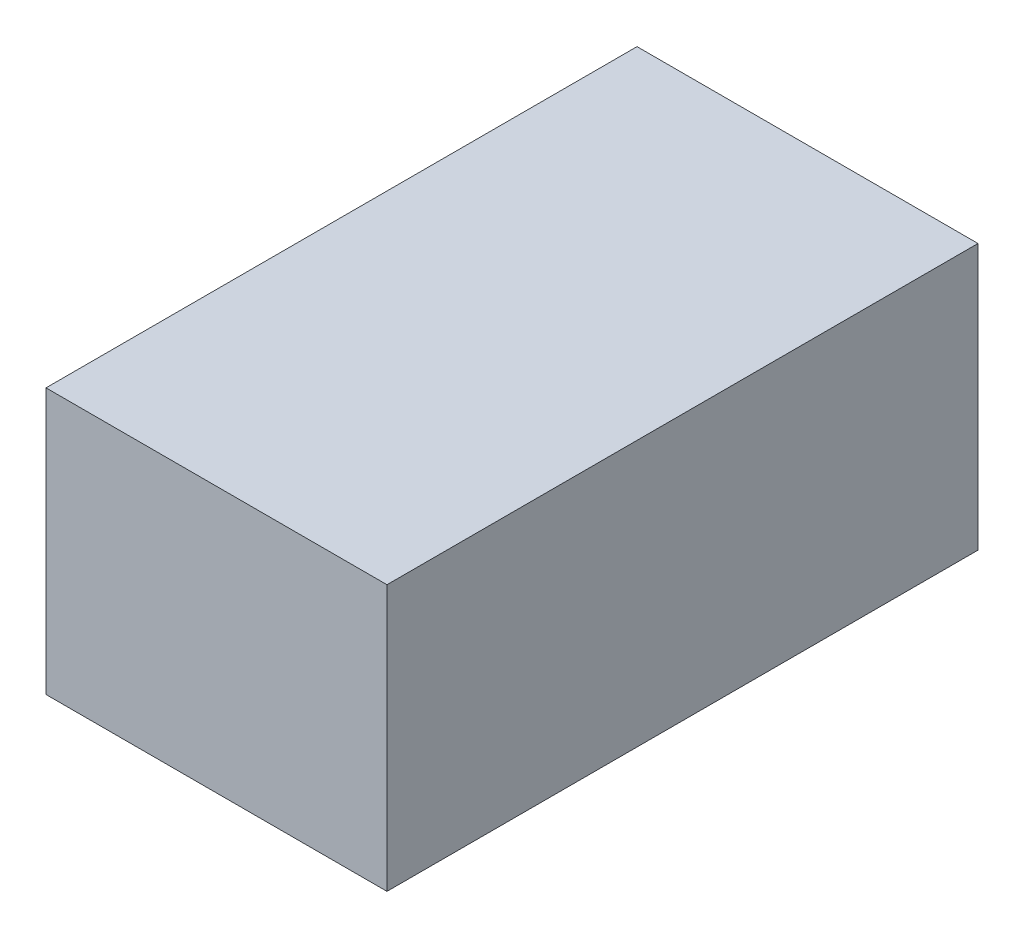
ISO-10303-21;
HEADER;
FILE_DESCRIPTION(('STEP AP214'),'2;1');
FILE_NAME('part.step','',(''),(''),'','','');
FILE_SCHEMA(('AUTOMOTIVE_DESIGN { 1 0 10303 214 1 1 1 1 }'));
ENDSEC;
DATA;
#1=APPLICATION_CONTEXT('core data for automotive mechanical design processes');
#2=APPLICATION_PROTOCOL_DEFINITION('international standard','automotive_design',2000,#1);
#3=PRODUCT_CONTEXT('',#1,'mechanical');
#4=PRODUCT('Part','Part','',(#3));
#5=PRODUCT_RELATED_PRODUCT_CATEGORY('part','',(#4));
#6=PRODUCT_DEFINITION_FORMATION('','',#4);
#7=PRODUCT_DEFINITION_CONTEXT('part definition',#1,'design');
#8=PRODUCT_DEFINITION('design','',#6,#7);
#9=PRODUCT_DEFINITION_SHAPE('','',#8);
#10=(LENGTH_UNIT() NAMED_UNIT(*) SI_UNIT(.MILLI.,.METRE.));
#11=(NAMED_UNIT(*) PLANE_ANGLE_UNIT() SI_UNIT($,.RADIAN.));
#12=(NAMED_UNIT(*) SI_UNIT($,.STERADIAN.) SOLID_ANGLE_UNIT());
#13=UNCERTAINTY_MEASURE_WITH_UNIT(LENGTH_MEASURE(1.E-05),#10,'distance_accuracy_value','');
#14=(GEOMETRIC_REPRESENTATION_CONTEXT(3) GLOBAL_UNCERTAINTY_ASSIGNED_CONTEXT((#13)) GLOBAL_UNIT_ASSIGNED_CONTEXT((#10,
#11,#12)) REPRESENTATION_CONTEXT('',''));
#15=CARTESIAN_POINT('',(0.,0.,0.));
#16=DIRECTION('',(0.,0.,1.));
#17=DIRECTION('',(1.,0.,0.));
#18=AXIS2_PLACEMENT_3D('',#15,#16,#17);
#19=CARTESIAN_POINT('',(-4.15076435804921,1.735,3.45567102980451));
#20=DIRECTION('',(0.,1.,0.));
#21=DIRECTION('',(0.,0.,1.));
#22=AXIS2_PLACEMENT_3D('',#19,#20,#21);
#23=PLANE('',#22);
#24=DIRECTION('',(0.,0.,1.));
#25=VECTOR('',#24,1.);
#26=CARTESIAN_POINT('',(-4.66430862572949,1.735,2.56552763249203));
#27=LINE('',#26,#25);
#28=CARTESIAN_POINT('',(-4.66430862572949,1.735,2.56552763249203));
#29=VERTEX_POINT('',#28);
#30=CARTESIAN_POINT('',(-4.66430862572949,1.735,4.34581442711699));
#31=VERTEX_POINT('',#30);
#32=EDGE_CURVE('E61',#29,#31,#27,.T.);
#33=ORIENTED_EDGE('',*,*,#32,.F.);
#34=DIRECTION('',(1.,0.,0.));
#35=VECTOR('',#34,1.);
#36=CARTESIAN_POINT('',(-4.15076435804921,1.735,2.56552763249203));
#37=LINE('',#36,#35);
#38=CARTESIAN_POINT('',(-3.63722009036893,1.735,2.56552763249203));
#39=VERTEX_POINT('',#38);
#40=EDGE_CURVE('E19',#39,#29,#37,.F.);
#41=ORIENTED_EDGE('',*,*,#40,.F.);
#42=DIRECTION('',(0.,0.,-1.));
#43=VECTOR('',#42,1.);
#44=CARTESIAN_POINT('',(-3.63722009036893,1.735,4.34581442711699));
#45=LINE('',#44,#43);
#46=CARTESIAN_POINT('',(-3.63722009036893,1.735,4.34581442711699));
#47=VERTEX_POINT('',#46);
#48=EDGE_CURVE('E68',#47,#39,#45,.T.);
#49=ORIENTED_EDGE('',*,*,#48,.F.);
#50=DIRECTION('',(1.,0.,0.));
#51=VECTOR('',#50,1.);
#52=CARTESIAN_POINT('',(-4.66430862572949,1.735,4.34581442711699));
#53=LINE('',#52,#51);
#54=EDGE_CURVE('E55',#31,#47,#53,.T.);
#55=ORIENTED_EDGE('',*,*,#54,.F.);
#56=EDGE_LOOP('',(#33,#41,#49,#55));
#57=FACE_BOUND('',#56,.T.);
#58=ADVANCED_FACE('F16',(#57),#23,.F.);
#59=CARTESIAN_POINT('',(-4.66430862572949,1.735,2.56552763249203));
#60=DIRECTION('',(-1.,0.,0.));
#61=DIRECTION('',(0.,0.,1.));
#62=AXIS2_PLACEMENT_3D('',#59,#60,#61);
#63=PLANE('',#62);
#64=ORIENTED_EDGE('',*,*,#32,.T.);
#65=DIRECTION('',(0.,1.,0.));
#66=VECTOR('',#65,1.);
#67=CARTESIAN_POINT('',(-4.66430862572949,1.735,4.34581442711699));
#68=LINE('',#67,#66);
#69=CARTESIAN_POINT('',(-4.66430862572949,2.535,4.34581442711699));
#70=VERTEX_POINT('',#69);
#71=EDGE_CURVE('E63',#70,#31,#68,.F.);
#72=ORIENTED_EDGE('',*,*,#71,.F.);
#73=DIRECTION('',(0.,0.,1.));
#74=VECTOR('',#73,1.);
#75=CARTESIAN_POINT('',(-4.66430862572949,2.535,3.45567102980451));
#76=LINE('',#75,#74);
#77=CARTESIAN_POINT('',(-4.66430862572949,2.535,2.56552763249203));
#78=VERTEX_POINT('',#77);
#79=EDGE_CURVE('E82',#78,#70,#76,.T.);
#80=ORIENTED_EDGE('',*,*,#79,.F.);
#81=DIRECTION('',(0.,1.,0.));
#82=VECTOR('',#81,1.);
#83=CARTESIAN_POINT('',(-4.66430862572949,1.735,2.56552763249203));
#84=LINE('',#83,#82);
#85=EDGE_CURVE('E66',#29,#78,#84,.T.);
#86=ORIENTED_EDGE('',*,*,#85,.F.);
#87=EDGE_LOOP('',(#64,#72,#80,#86));
#88=FACE_BOUND('',#87,.T.);
#89=ADVANCED_FACE('F62',(#88),#63,.T.);
#90=CARTESIAN_POINT('',(-4.66430862572949,1.735,4.34581442711699));
#91=DIRECTION('',(0.,0.,1.));
#92=DIRECTION('',(1.,0.,0.));
#93=AXIS2_PLACEMENT_3D('',#90,#91,#92);
#94=PLANE('',#93);
#95=ORIENTED_EDGE('',*,*,#54,.T.);
#96=DIRECTION('',(0.,1.,0.));
#97=VECTOR('',#96,1.);
#98=CARTESIAN_POINT('',(-3.63722009036893,1.735,4.34581442711699));
#99=LINE('',#98,#97);
#100=CARTESIAN_POINT('',(-3.63722009036893,2.535,4.34581442711699));
#101=VERTEX_POINT('',#100);
#102=EDGE_CURVE('E70',#101,#47,#99,.F.);
#103=ORIENTED_EDGE('',*,*,#102,.F.);
#104=DIRECTION('',(1.,0.,0.));
#105=VECTOR('',#104,1.);
#106=CARTESIAN_POINT('',(-0.607308911055287,2.535,4.34581442711699));
#107=LINE('',#106,#105);
#108=EDGE_CURVE('E74',#70,#101,#107,.T.);
#109=ORIENTED_EDGE('',*,*,#108,.F.);
#110=ORIENTED_EDGE('',*,*,#71,.T.);
#111=EDGE_LOOP('',(#95,#103,#109,#110));
#112=FACE_BOUND('',#111,.T.);
#113=ADVANCED_FACE('F72',(#112),#94,.T.);
#114=CARTESIAN_POINT('',(-3.63722009036893,1.735,4.34581442711699));
#115=DIRECTION('',(1.,0.,0.));
#116=DIRECTION('',(0.,0.,-1.));
#117=AXIS2_PLACEMENT_3D('',#114,#115,#116);
#118=PLANE('',#117);
#119=ORIENTED_EDGE('',*,*,#48,.T.);
#120=DIRECTION('',(0.,1.,0.));
#121=VECTOR('',#120,1.);
#122=CARTESIAN_POINT('',(-3.63722009036893,1.735,2.56552763249203));
#123=LINE('',#122,#121);
#124=CARTESIAN_POINT('',(-3.63722009036893,2.535,2.56552763249203));
#125=VERTEX_POINT('',#124);
#126=EDGE_CURVE('E34',#125,#39,#123,.F.);
#127=ORIENTED_EDGE('',*,*,#126,.F.);
#128=DIRECTION('',(0.,0.,1.));
#129=VECTOR('',#128,1.);
#130=CARTESIAN_POINT('',(-3.63722009036893,2.535,3.45567102980451));
#131=LINE('',#130,#129);
#132=EDGE_CURVE('E25',#101,#125,#131,.F.);
#133=ORIENTED_EDGE('',*,*,#132,.F.);
#134=ORIENTED_EDGE('',*,*,#102,.T.);
#135=EDGE_LOOP('',(#119,#127,#133,#134));
#136=FACE_BOUND('',#135,.T.);
#137=ADVANCED_FACE('F88',(#136),#118,.T.);
#138=CARTESIAN_POINT('',(-3.63722009036893,1.735,2.56552763249203));
#139=DIRECTION('',(0.,0.,-1.));
#140=DIRECTION('',(-1.,0.,0.));
#141=AXIS2_PLACEMENT_3D('',#138,#139,#140);
#142=PLANE('',#141);
#143=ORIENTED_EDGE('',*,*,#40,.T.);
#144=ORIENTED_EDGE('',*,*,#85,.T.);
#145=DIRECTION('',(1.,0.,0.));
#146=VECTOR('',#145,1.);
#147=CARTESIAN_POINT('',(-0.607308911055287,2.535,2.56552763249203));
#148=LINE('',#147,#146);
#149=EDGE_CURVE('E10',#125,#78,#148,.F.);
#150=ORIENTED_EDGE('',*,*,#149,.F.);
#151=ORIENTED_EDGE('',*,*,#126,.T.);
#152=EDGE_LOOP('',(#143,#144,#150,#151));
#153=FACE_BOUND('',#152,.T.);
#154=ADVANCED_FACE('F90',(#153),#142,.T.);
#155=CARTESIAN_POINT('',(-0.607308911055287,2.535,3.45567102980451));
#156=DIRECTION('',(0.,1.,0.));
#157=DIRECTION('',(0.,0.,1.));
#158=AXIS2_PLACEMENT_3D('',#155,#156,#157);
#159=PLANE('',#158);
#160=ORIENTED_EDGE('',*,*,#132,.T.);
#161=ORIENTED_EDGE('',*,*,#149,.T.);
#162=ORIENTED_EDGE('',*,*,#79,.T.);
#163=ORIENTED_EDGE('',*,*,#108,.T.);
#164=EDGE_LOOP('',(#160,#161,#162,#163));
#165=FACE_BOUND('',#164,.T.);
#166=ADVANCED_FACE('F87',(#165),#159,.T.);
#167=CLOSED_SHELL('',(#58,#89,#113,#137,#154,#166));
#168=MANIFOLD_SOLID_BREP('B1',#167);
#169=ADVANCED_BREP_SHAPE_REPRESENTATION('',(#18,#168),#14);
#170=SHAPE_DEFINITION_REPRESENTATION(#9,#169);
ENDSEC;
END-ISO-10303-21;
